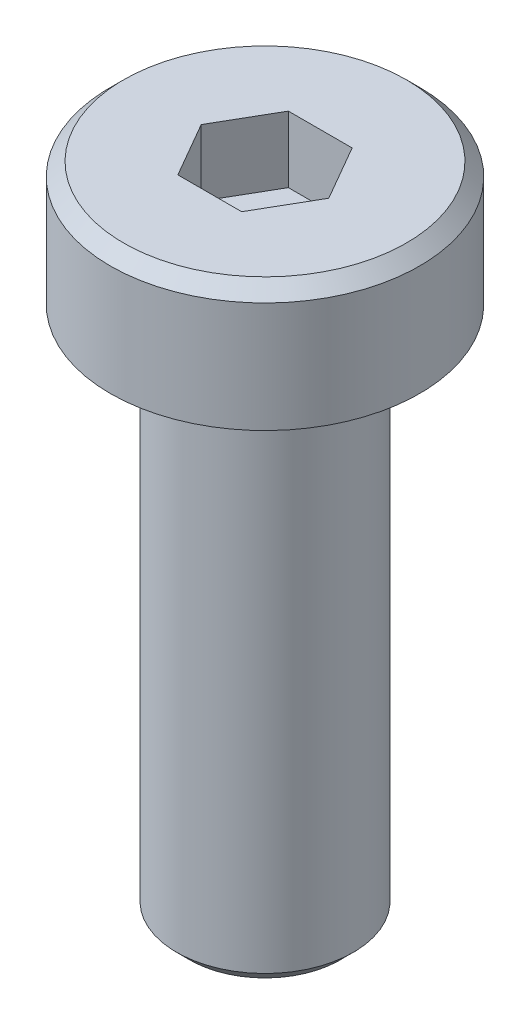
ISO-10303-21;
HEADER;
FILE_DESCRIPTION(('STEP AP214'),'2;1');
FILE_NAME('part.step','',(''),(''),'','','');
FILE_SCHEMA(('AUTOMOTIVE_DESIGN { 1 0 10303 214 1 1 1 1 }'));
ENDSEC;
DATA;
#1=APPLICATION_CONTEXT('core data for automotive mechanical design processes');
#2=APPLICATION_PROTOCOL_DEFINITION('international standard','automotive_design',2000,#1);
#3=PRODUCT_CONTEXT('',#1,'mechanical');
#4=PRODUCT('Part','Part','',(#3));
#5=PRODUCT_RELATED_PRODUCT_CATEGORY('part','',(#4));
#6=PRODUCT_DEFINITION_FORMATION('','',#4);
#7=PRODUCT_DEFINITION_CONTEXT('part definition',#1,'design');
#8=PRODUCT_DEFINITION('design','',#6,#7);
#9=PRODUCT_DEFINITION_SHAPE('','',#8);
#10=(LENGTH_UNIT() NAMED_UNIT(*) SI_UNIT(.MILLI.,.METRE.));
#11=(NAMED_UNIT(*) PLANE_ANGLE_UNIT() SI_UNIT($,.RADIAN.));
#12=(NAMED_UNIT(*) SI_UNIT($,.STERADIAN.) SOLID_ANGLE_UNIT());
#13=UNCERTAINTY_MEASURE_WITH_UNIT(LENGTH_MEASURE(1.E-05),#10,'distance_accuracy_value','');
#14=(GEOMETRIC_REPRESENTATION_CONTEXT(3) GLOBAL_UNCERTAINTY_ASSIGNED_CONTEXT((#13)) GLOBAL_UNIT_ASSIGNED_CONTEXT((#10,
#11,#12)) REPRESENTATION_CONTEXT('',''));
#15=CARTESIAN_POINT('',(0.,0.,0.));
#16=DIRECTION('',(0.,0.,1.));
#17=DIRECTION('',(1.,0.,0.));
#18=AXIS2_PLACEMENT_3D('',#15,#16,#17);
#19=CARTESIAN_POINT('',(0.,-12.,0.));
#20=DIRECTION('',(0.,-1.,0.));
#21=DIRECTION('',(0.,0.,-1.));
#22=AXIS2_PLACEMENT_3D('',#19,#20,#21);
#23=PLANE('',#22);
#24=CARTESIAN_POINT('',(0.,-12.,0.));
#25=DIRECTION('',(0.,-1.,0.));
#26=DIRECTION('',(0.,0.,-1.));
#27=AXIS2_PLACEMENT_3D('',#24,#25,#26);
#28=CIRCLE('',#27,1.7);
#29=CARTESIAN_POINT('',(0.,-12.,-1.7));
#30=VERTEX_POINT('',#29);
#31=EDGE_CURVE('E11',#30,#30,#28,.T.);
#32=ORIENTED_EDGE('',*,*,#31,.T.);
#33=EDGE_LOOP('',(#32));
#34=FACE_BOUND('',#33,.T.);
#35=ADVANCED_FACE('F44',(#34),#23,.T.);
#36=CARTESIAN_POINT('',(0.,-12.,0.));
#37=DIRECTION('',(0.,1.,0.));
#38=DIRECTION('',(0.,0.,1.));
#39=AXIS2_PLACEMENT_3D('',#36,#37,#38);
#40=CONICAL_SURFACE('',#39,1.7,0.785398163397446);
#41=CARTESIAN_POINT('',(0.,-11.7,0.));
#42=DIRECTION('',(0.,-1.,0.));
#43=DIRECTION('',(0.,0.,-1.));
#44=AXIS2_PLACEMENT_3D('',#41,#42,#43);
#45=CIRCLE('',#44,2.);
#46=CARTESIAN_POINT('',(0.,-11.7,-2.));
#47=VERTEX_POINT('',#46);
#48=EDGE_CURVE('E52',#47,#47,#45,.T.);
#49=ORIENTED_EDGE('',*,*,#48,.T.);
#50=EDGE_LOOP('',(#49));
#51=FACE_BOUND('',#50,.T.);
#52=ORIENTED_EDGE('',*,*,#31,.F.);
#53=EDGE_LOOP('',(#52));
#54=FACE_BOUND('',#53,.T.);
#55=ADVANCED_FACE('F189',(#51,#54),#40,.T.);
#56=CARTESIAN_POINT('',(0.,-14.,0.));
#57=DIRECTION('',(0.,-1.,0.));
#58=DIRECTION('',(0.,0.,-1.));
#59=AXIS2_PLACEMENT_3D('',#56,#57,#58);
#60=CYLINDRICAL_SURFACE('',#59,2.);
#61=CARTESIAN_POINT('',(0.,0.,0.));
#62=DIRECTION('',(0.,-1.,0.));
#63=DIRECTION('',(0.,0.,-1.));
#64=AXIS2_PLACEMENT_3D('',#61,#62,#63);
#65=CIRCLE('',#64,2.);
#66=CARTESIAN_POINT('',(0.,0.,-2.));
#67=VERTEX_POINT('',#66);
#68=EDGE_CURVE('E178',#67,#67,#65,.T.);
#69=ORIENTED_EDGE('',*,*,#68,.T.);
#70=EDGE_LOOP('',(#69));
#71=FACE_BOUND('',#70,.T.);
#72=ORIENTED_EDGE('',*,*,#48,.F.);
#73=EDGE_LOOP('',(#72));
#74=FACE_BOUND('',#73,.T.);
#75=ADVANCED_FACE('F186',(#71,#74),#60,.T.);
#76=CARTESIAN_POINT('',(2.,0.,0.));
#77=DIRECTION('',(0.,-1.,0.));
#78=DIRECTION('',(0.,0.,-1.));
#79=AXIS2_PLACEMENT_3D('',#76,#77,#78);
#80=PLANE('',#79);
#81=CARTESIAN_POINT('',(0.,0.,0.));
#82=DIRECTION('',(0.,-1.,0.));
#83=DIRECTION('',(0.,0.,-1.));
#84=AXIS2_PLACEMENT_3D('',#81,#82,#83);
#85=CIRCLE('',#84,3.5);
#86=CARTESIAN_POINT('',(0.,0.,-3.5));
#87=VERTEX_POINT('',#86);
#88=EDGE_CURVE('E177',#87,#87,#85,.T.);
#89=ORIENTED_EDGE('',*,*,#88,.T.);
#90=EDGE_LOOP('',(#89));
#91=FACE_BOUND('',#90,.T.);
#92=ORIENTED_EDGE('',*,*,#68,.F.);
#93=EDGE_LOOP('',(#92));
#94=FACE_BOUND('',#93,.T.);
#95=ADVANCED_FACE('F194',(#91,#94),#80,.T.);
#96=CARTESIAN_POINT('',(0.,-14.,0.));
#97=DIRECTION('',(0.,-1.,0.));
#98=DIRECTION('',(0.,0.,-1.));
#99=AXIS2_PLACEMENT_3D('',#96,#97,#98);
#100=CYLINDRICAL_SURFACE('',#99,3.5);
#101=CARTESIAN_POINT('',(0.,2.5,0.));
#102=DIRECTION('',(0.,-1.,0.));
#103=DIRECTION('',(0.,0.,-1.));
#104=AXIS2_PLACEMENT_3D('',#101,#102,#103);
#105=CIRCLE('',#104,3.5);
#106=CARTESIAN_POINT('',(0.,2.5,-3.5));
#107=VERTEX_POINT('',#106);
#108=EDGE_CURVE('E174',#107,#107,#105,.T.);
#109=ORIENTED_EDGE('',*,*,#108,.T.);
#110=EDGE_LOOP('',(#109));
#111=FACE_BOUND('',#110,.T.);
#112=ORIENTED_EDGE('',*,*,#88,.F.);
#113=EDGE_LOOP('',(#112));
#114=FACE_BOUND('',#113,.T.);
#115=ADVANCED_FACE('F200',(#111,#114),#100,.T.);
#116=CARTESIAN_POINT('',(0.,2.5,0.));
#117=DIRECTION('',(0.,-1.,0.));
#118=DIRECTION('',(0.,0.,-1.));
#119=AXIS2_PLACEMENT_3D('',#116,#117,#118);
#120=CONICAL_SURFACE('',#119,3.5,0.785398163397451);
#121=CARTESIAN_POINT('',(0.,2.8,0.));
#122=DIRECTION('',(0.,-1.,0.));
#123=DIRECTION('',(0.,0.,-1.));
#124=AXIS2_PLACEMENT_3D('',#121,#122,#123);
#125=CIRCLE('',#124,3.2);
#126=CARTESIAN_POINT('',(0.,2.8,-3.2));
#127=VERTEX_POINT('',#126);
#128=EDGE_CURVE('E157',#127,#127,#125,.T.);
#129=ORIENTED_EDGE('',*,*,#128,.T.);
#130=EDGE_LOOP('',(#129));
#131=FACE_BOUND('',#130,.T.);
#132=ORIENTED_EDGE('',*,*,#108,.F.);
#133=EDGE_LOOP('',(#132));
#134=FACE_BOUND('',#133,.T.);
#135=ADVANCED_FACE('F234',(#131,#134),#120,.T.);
#136=CARTESIAN_POINT('',(3.2,2.8,0.));
#137=DIRECTION('',(0.,1.,0.));
#138=DIRECTION('',(0.,0.,1.));
#139=AXIS2_PLACEMENT_3D('',#136,#137,#138);
#140=PLANE('',#139);
#141=DIRECTION('',(0.5,0.,-0.866025403784439));
#142=VECTOR('',#141,1.);
#143=CARTESIAN_POINT('',(0.721687836487032,2.8,1.25));
#144=LINE('',#143,#142);
#145=CARTESIAN_POINT('',(0.721687836487032,2.8,1.25));
#146=VERTEX_POINT('',#145);
#147=CARTESIAN_POINT('',(1.44337567297406,2.8,0.));
#148=VERTEX_POINT('',#147);
#149=EDGE_CURVE('E58',#146,#148,#144,.T.);
#150=ORIENTED_EDGE('',*,*,#149,.F.);
#151=DIRECTION('',(1.,0.,0.));
#152=VECTOR('',#151,1.);
#153=CARTESIAN_POINT('',(-0.721687836487033,2.8,1.25));
#154=LINE('',#153,#152);
#155=CARTESIAN_POINT('',(-0.721687836487033,2.8,1.25));
#156=VERTEX_POINT('',#155);
#157=EDGE_CURVE('E153',#156,#146,#154,.T.);
#158=ORIENTED_EDGE('',*,*,#157,.F.);
#159=DIRECTION('',(0.5,0.,0.866025403784439));
#160=VECTOR('',#159,1.);
#161=CARTESIAN_POINT('',(-1.44337567297406,2.8,0.));
#162=LINE('',#161,#160);
#163=CARTESIAN_POINT('',(-1.44337567297406,2.8,0.));
#164=VERTEX_POINT('',#163);
#165=EDGE_CURVE('E147',#164,#156,#162,.T.);
#166=ORIENTED_EDGE('',*,*,#165,.F.);
#167=DIRECTION('',(-0.5,0.,0.866025403784439));
#168=VECTOR('',#167,1.);
#169=CARTESIAN_POINT('',(-0.721687836487032,2.8,-1.25));
#170=LINE('',#169,#168);
#171=CARTESIAN_POINT('',(-0.721687836487032,2.8,-1.25));
#172=VERTEX_POINT('',#171);
#173=EDGE_CURVE('E107',#172,#164,#170,.T.);
#174=ORIENTED_EDGE('',*,*,#173,.F.);
#175=DIRECTION('',(-1.,0.,0.));
#176=VECTOR('',#175,1.);
#177=CARTESIAN_POINT('',(0.721687836487032,2.8,-1.25));
#178=LINE('',#177,#176);
#179=CARTESIAN_POINT('',(0.721687836487032,2.8,-1.25));
#180=VERTEX_POINT('',#179);
#181=EDGE_CURVE('E145',#180,#172,#178,.T.);
#182=ORIENTED_EDGE('',*,*,#181,.F.);
#183=DIRECTION('',(-0.5,0.,-0.866025403784439));
#184=VECTOR('',#183,1.);
#185=CARTESIAN_POINT('',(1.44337567297406,2.8,0.));
#186=LINE('',#185,#184);
#187=EDGE_CURVE('E138',#148,#180,#186,.T.);
#188=ORIENTED_EDGE('',*,*,#187,.F.);
#189=EDGE_LOOP('',(#150,#158,#166,#174,#182,#188));
#190=FACE_BOUND('',#189,.T.);
#191=ORIENTED_EDGE('',*,*,#128,.F.);
#192=EDGE_LOOP('',(#191));
#193=FACE_BOUND('',#192,.T.);
#194=ADVANCED_FACE('F244',(#190,#193),#140,.T.);
#195=CARTESIAN_POINT('',(0.721687836487032,1.3,1.25));
#196=DIRECTION('',(0.866025403784439,0.,0.5));
#197=DIRECTION('',(0.5,0.,-0.866025403784439));
#198=AXIS2_PLACEMENT_3D('',#195,#196,#197);
#199=PLANE('',#198);
#200=ORIENTED_EDGE('',*,*,#149,.T.);
#201=DIRECTION('',(0.,1.,0.));
#202=VECTOR('',#201,1.);
#203=CARTESIAN_POINT('',(1.44337567297406,1.3,0.));
#204=LINE('',#203,#202);
#205=CARTESIAN_POINT('',(1.44337567297406,1.3,0.));
#206=VERTEX_POINT('',#205);
#207=EDGE_CURVE('E89',#206,#148,#204,.T.);
#208=ORIENTED_EDGE('',*,*,#207,.F.);
#209=DIRECTION('',(0.5,0.,-0.866025403784439));
#210=VECTOR('',#209,1.);
#211=CARTESIAN_POINT('',(0.721687836487032,1.3,1.25));
#212=LINE('',#211,#210);
#213=CARTESIAN_POINT('',(0.721687836487032,1.3,1.25));
#214=VERTEX_POINT('',#213);
#215=EDGE_CURVE('E156',#214,#206,#212,.T.);
#216=ORIENTED_EDGE('',*,*,#215,.F.);
#217=DIRECTION('',(0.,1.,0.));
#218=VECTOR('',#217,1.);
#219=CARTESIAN_POINT('',(0.721687836487032,1.3,1.25));
#220=LINE('',#219,#218);
#221=EDGE_CURVE('E70',#214,#146,#220,.T.);
#222=ORIENTED_EDGE('',*,*,#221,.T.);
#223=EDGE_LOOP('',(#200,#208,#216,#222));
#224=FACE_BOUND('',#223,.T.);
#225=ADVANCED_FACE('F252',(#224),#199,.F.);
#226=CARTESIAN_POINT('',(-0.721687836487033,1.3,1.25));
#227=DIRECTION('',(0.,0.,1.));
#228=DIRECTION('',(1.,0.,0.));
#229=AXIS2_PLACEMENT_3D('',#226,#227,#228);
#230=PLANE('',#229);
#231=ORIENTED_EDGE('',*,*,#157,.T.);
#232=ORIENTED_EDGE('',*,*,#221,.F.);
#233=DIRECTION('',(1.,0.,0.));
#234=VECTOR('',#233,1.);
#235=CARTESIAN_POINT('',(-0.721687836487033,1.3,1.25));
#236=LINE('',#235,#234);
#237=CARTESIAN_POINT('',(-0.721687836487033,1.3,1.25));
#238=VERTEX_POINT('',#237);
#239=EDGE_CURVE('E124',#238,#214,#236,.T.);
#240=ORIENTED_EDGE('',*,*,#239,.F.);
#241=DIRECTION('',(0.,1.,0.));
#242=VECTOR('',#241,1.);
#243=CARTESIAN_POINT('',(-0.721687836487033,1.3,1.25));
#244=LINE('',#243,#242);
#245=EDGE_CURVE('E114',#238,#156,#244,.T.);
#246=ORIENTED_EDGE('',*,*,#245,.T.);
#247=EDGE_LOOP('',(#231,#232,#240,#246));
#248=FACE_BOUND('',#247,.T.);
#249=ADVANCED_FACE('F265',(#248),#230,.F.);
#250=CARTESIAN_POINT('',(-1.44337567297406,1.3,0.));
#251=DIRECTION('',(-0.866025403784439,0.,0.5));
#252=DIRECTION('',(0.5,0.,0.866025403784439));
#253=AXIS2_PLACEMENT_3D('',#250,#251,#252);
#254=PLANE('',#253);
#255=ORIENTED_EDGE('',*,*,#165,.T.);
#256=ORIENTED_EDGE('',*,*,#245,.F.);
#257=DIRECTION('',(0.5,0.,0.866025403784439));
#258=VECTOR('',#257,1.);
#259=CARTESIAN_POINT('',(-1.44337567297406,1.3,0.));
#260=LINE('',#259,#258);
#261=CARTESIAN_POINT('',(-1.44337567297406,1.3,0.));
#262=VERTEX_POINT('',#261);
#263=EDGE_CURVE('E119',#262,#238,#260,.T.);
#264=ORIENTED_EDGE('',*,*,#263,.F.);
#265=DIRECTION('',(0.,1.,0.));
#266=VECTOR('',#265,1.);
#267=CARTESIAN_POINT('',(-1.44337567297406,1.3,0.));
#268=LINE('',#267,#266);
#269=EDGE_CURVE('E101',#262,#164,#268,.T.);
#270=ORIENTED_EDGE('',*,*,#269,.T.);
#271=EDGE_LOOP('',(#255,#256,#264,#270));
#272=FACE_BOUND('',#271,.T.);
#273=ADVANCED_FACE('F117',(#272),#254,.F.);
#274=CARTESIAN_POINT('',(-0.721687836487032,1.3,-1.25));
#275=DIRECTION('',(-0.866025403784438,0.,-0.5));
#276=DIRECTION('',(-0.5,0.,0.866025403784439));
#277=AXIS2_PLACEMENT_3D('',#274,#275,#276);
#278=PLANE('',#277);
#279=ORIENTED_EDGE('',*,*,#173,.T.);
#280=ORIENTED_EDGE('',*,*,#269,.F.);
#281=DIRECTION('',(-0.5,0.,0.866025403784439));
#282=VECTOR('',#281,1.);
#283=CARTESIAN_POINT('',(-0.721687836487032,1.3,-1.25));
#284=LINE('',#283,#282);
#285=CARTESIAN_POINT('',(-0.721687836487032,1.3,-1.25));
#286=VERTEX_POINT('',#285);
#287=EDGE_CURVE('E104',#286,#262,#284,.T.);
#288=ORIENTED_EDGE('',*,*,#287,.F.);
#289=DIRECTION('',(0.,1.,0.));
#290=VECTOR('',#289,1.);
#291=CARTESIAN_POINT('',(-0.721687836487032,1.3,-1.25));
#292=LINE('',#291,#290);
#293=EDGE_CURVE('E111',#286,#172,#292,.T.);
#294=ORIENTED_EDGE('',*,*,#293,.T.);
#295=EDGE_LOOP('',(#279,#280,#288,#294));
#296=FACE_BOUND('',#295,.T.);
#297=ADVANCED_FACE('F103',(#296),#278,.F.);
#298=CARTESIAN_POINT('',(0.721687836487032,1.3,-1.25));
#299=DIRECTION('',(0.,0.,-1.));
#300=DIRECTION('',(-1.,0.,0.));
#301=AXIS2_PLACEMENT_3D('',#298,#299,#300);
#302=PLANE('',#301);
#303=ORIENTED_EDGE('',*,*,#181,.T.);
#304=ORIENTED_EDGE('',*,*,#293,.F.);
#305=DIRECTION('',(-1.,0.,0.));
#306=VECTOR('',#305,1.);
#307=CARTESIAN_POINT('',(0.721687836487032,1.3,-1.25));
#308=LINE('',#307,#306);
#309=CARTESIAN_POINT('',(0.721687836487032,1.3,-1.25));
#310=VERTEX_POINT('',#309);
#311=EDGE_CURVE('E126',#310,#286,#308,.T.);
#312=ORIENTED_EDGE('',*,*,#311,.F.);
#313=DIRECTION('',(0.,1.,0.));
#314=VECTOR('',#313,1.);
#315=CARTESIAN_POINT('',(0.721687836487032,1.3,-1.25));
#316=LINE('',#315,#314);
#317=EDGE_CURVE('E163',#310,#180,#316,.T.);
#318=ORIENTED_EDGE('',*,*,#317,.T.);
#319=EDGE_LOOP('',(#303,#304,#312,#318));
#320=FACE_BOUND('',#319,.T.);
#321=ADVANCED_FACE('F289',(#320),#302,.F.);
#322=CARTESIAN_POINT('',(1.44337567297406,1.3,0.));
#323=DIRECTION('',(0.866025403784439,0.,-0.5));
#324=DIRECTION('',(-0.5,0.,-0.866025403784439));
#325=AXIS2_PLACEMENT_3D('',#322,#323,#324);
#326=PLANE('',#325);
#327=ORIENTED_EDGE('',*,*,#187,.T.);
#328=ORIENTED_EDGE('',*,*,#317,.F.);
#329=DIRECTION('',(-0.5,0.,-0.866025403784439));
#330=VECTOR('',#329,1.);
#331=CARTESIAN_POINT('',(1.44337567297406,1.3,0.));
#332=LINE('',#331,#330);
#333=EDGE_CURVE('E134',#206,#310,#332,.T.);
#334=ORIENTED_EDGE('',*,*,#333,.F.);
#335=ORIENTED_EDGE('',*,*,#207,.T.);
#336=EDGE_LOOP('',(#327,#328,#334,#335));
#337=FACE_BOUND('',#336,.T.);
#338=ADVANCED_FACE('F298',(#337),#326,.F.);
#339=CARTESIAN_POINT('',(0.,1.3,0.));
#340=DIRECTION('',(0.,1.,0.));
#341=DIRECTION('',(0.,0.,1.));
#342=AXIS2_PLACEMENT_3D('',#339,#340,#341);
#343=PLANE('',#342);
#344=ORIENTED_EDGE('',*,*,#215,.T.);
#345=ORIENTED_EDGE('',*,*,#333,.T.);
#346=ORIENTED_EDGE('',*,*,#311,.T.);
#347=ORIENTED_EDGE('',*,*,#287,.T.);
#348=ORIENTED_EDGE('',*,*,#263,.T.);
#349=ORIENTED_EDGE('',*,*,#239,.T.);
#350=EDGE_LOOP('',(#344,#345,#346,#347,#348,#349));
#351=FACE_BOUND('',#350,.T.);
#352=ADVANCED_FACE('F123',(#351),#343,.T.);
#353=CLOSED_SHELL('',(#35,#55,#75,#95,#115,#135,#194,#225,#249,#273,#297,#321,#338,#352));
#354=MANIFOLD_SOLID_BREP('B2',#353);
#355=ADVANCED_BREP_SHAPE_REPRESENTATION('',(#18,#354),#14);
#356=SHAPE_DEFINITION_REPRESENTATION(#9,#355);
ENDSEC;
END-ISO-10303-21;
